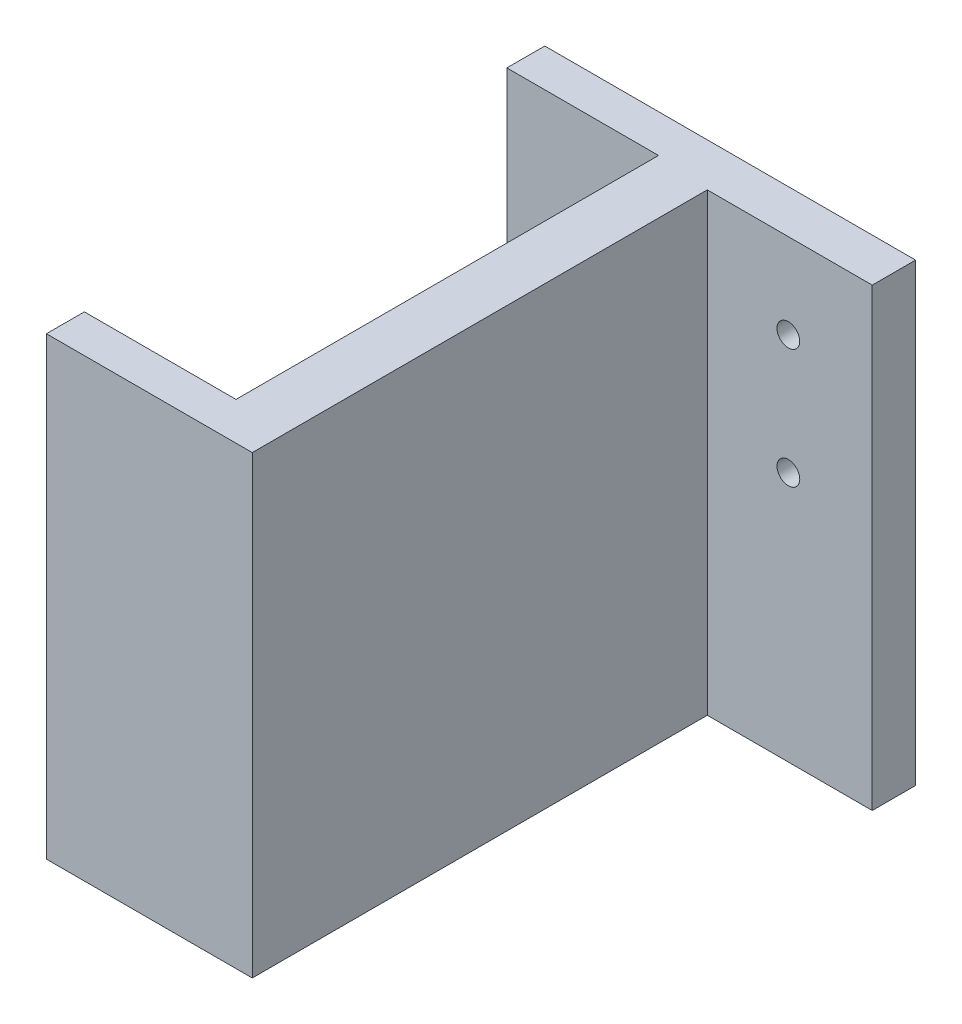
ISO-10303-21;
HEADER;
FILE_DESCRIPTION(('STEP AP214'),'2;1');
FILE_NAME('part.step','',(''),(''),'','','');
FILE_SCHEMA(('AUTOMOTIVE_DESIGN { 1 0 10303 214 1 1 1 1 }'));
ENDSEC;
DATA;
#1=APPLICATION_CONTEXT('core data for automotive mechanical design processes');
#2=APPLICATION_PROTOCOL_DEFINITION('international standard','automotive_design',2000,#1);
#3=PRODUCT_CONTEXT('',#1,'mechanical');
#4=PRODUCT('Part','Part','',(#3));
#5=PRODUCT_RELATED_PRODUCT_CATEGORY('part','',(#4));
#6=PRODUCT_DEFINITION_FORMATION('','',#4);
#7=PRODUCT_DEFINITION_CONTEXT('part definition',#1,'design');
#8=PRODUCT_DEFINITION('design','',#6,#7);
#9=PRODUCT_DEFINITION_SHAPE('','',#8);
#10=(LENGTH_UNIT() NAMED_UNIT(*) SI_UNIT(.MILLI.,.METRE.));
#11=(NAMED_UNIT(*) PLANE_ANGLE_UNIT() SI_UNIT($,.RADIAN.));
#12=(NAMED_UNIT(*) SI_UNIT($,.STERADIAN.) SOLID_ANGLE_UNIT());
#13=UNCERTAINTY_MEASURE_WITH_UNIT(LENGTH_MEASURE(1.E-05),#10,'distance_accuracy_value','');
#14=(GEOMETRIC_REPRESENTATION_CONTEXT(3) GLOBAL_UNCERTAINTY_ASSIGNED_CONTEXT((#13)) GLOBAL_UNIT_ASSIGNED_CONTEXT((#10,
#11,#12)) REPRESENTATION_CONTEXT('',''));
#15=CARTESIAN_POINT('',(0.,0.,0.));
#16=DIRECTION('',(0.,0.,1.));
#17=DIRECTION('',(1.,0.,0.));
#18=AXIS2_PLACEMENT_3D('',#15,#16,#17);
#19=CARTESIAN_POINT('',(0.,30.,0.));
#20=DIRECTION('',(1.,0.,0.));
#21=DIRECTION('',(0.,0.,-1.));
#22=AXIS2_PLACEMENT_3D('',#19,#20,#21);
#23=PLANE('',#22);
#24=DIRECTION('',(0.,1.,0.));
#25=VECTOR('',#24,1.);
#26=CARTESIAN_POINT('',(0.,27.5,-30.3571428571429));
#27=LINE('',#26,#25);
#28=CARTESIAN_POINT('',(0.,2.5,-30.3571428571429));
#29=VERTEX_POINT('',#28);
#30=CARTESIAN_POINT('',(0.,30.,-30.3571428571429));
#31=VERTEX_POINT('',#30);
#32=EDGE_CURVE('E56',#29,#31,#27,.T.);
#33=ORIENTED_EDGE('',*,*,#32,.F.);
#34=DIRECTION('',(0.,0.,-1.));
#35=VECTOR('',#34,1.);
#36=CARTESIAN_POINT('',(0.,2.5,-30.3571428571429));
#37=LINE('',#36,#35);
#38=CARTESIAN_POINT('',(0.,2.5,-2.5));
#39=VERTEX_POINT('',#38);
#40=EDGE_CURVE('E232',#39,#29,#37,.T.);
#41=ORIENTED_EDGE('',*,*,#40,.F.);
#42=DIRECTION('',(0.,-1.,0.));
#43=VECTOR('',#42,1.);
#44=CARTESIAN_POINT('',(0.,2.5,-2.5));
#45=LINE('',#44,#43);
#46=CARTESIAN_POINT('',(0.,30.,-2.5));
#47=VERTEX_POINT('',#46);
#48=EDGE_CURVE('E61',#47,#39,#45,.T.);
#49=ORIENTED_EDGE('',*,*,#48,.F.);
#50=DIRECTION('',(0.,0.,1.));
#51=VECTOR('',#50,1.);
#52=CARTESIAN_POINT('',(0.,30.,0.));
#53=LINE('',#52,#51);
#54=EDGE_CURVE('E142',#31,#47,#53,.T.);
#55=ORIENTED_EDGE('',*,*,#54,.F.);
#56=EDGE_LOOP('',(#33,#41,#49,#55));
#57=FACE_BOUND('',#56,.T.);
#58=ADVANCED_FACE('F38',(#57),#23,.F.);
#59=CARTESIAN_POINT('',(3.57142857142857,30.,0.));
#60=DIRECTION('',(0.,0.,-1.));
#61=DIRECTION('',(-1.,0.,0.));
#62=AXIS2_PLACEMENT_3D('',#59,#60,#61);
#63=PLANE('',#62);
#64=DIRECTION('',(1.,0.,0.));
#65=VECTOR('',#64,1.);
#66=CARTESIAN_POINT('',(3.57142857142857,0.,0.));
#67=LINE('',#66,#65);
#68=CARTESIAN_POINT('',(-10.,0.,0.));
#69=VERTEX_POINT('',#68);
#70=CARTESIAN_POINT('',(3.57142857142857,0.,0.));
#71=VERTEX_POINT('',#70);
#72=EDGE_CURVE('E144',#69,#71,#67,.T.);
#73=ORIENTED_EDGE('',*,*,#72,.T.);
#74=DIRECTION('',(0.,-1.,0.));
#75=VECTOR('',#74,1.);
#76=CARTESIAN_POINT('',(3.57142857142857,30.,0.));
#77=LINE('',#76,#75);
#78=CARTESIAN_POINT('',(3.57142857142857,30.,0.));
#79=VERTEX_POINT('',#78);
#80=EDGE_CURVE('E11',#79,#71,#77,.T.);
#81=ORIENTED_EDGE('',*,*,#80,.F.);
#82=DIRECTION('',(1.,0.,0.));
#83=VECTOR('',#82,1.);
#84=CARTESIAN_POINT('',(3.57142857142857,30.,0.));
#85=LINE('',#84,#83);
#86=CARTESIAN_POINT('',(-10.,30.,0.));
#87=VERTEX_POINT('',#86);
#88=EDGE_CURVE('E155',#87,#79,#85,.T.);
#89=ORIENTED_EDGE('',*,*,#88,.F.);
#90=DIRECTION('',(0.,1.,0.));
#91=VECTOR('',#90,1.);
#92=CARTESIAN_POINT('',(-10.,30.,0.));
#93=LINE('',#92,#91);
#94=EDGE_CURVE('E135',#69,#87,#93,.T.);
#95=ORIENTED_EDGE('',*,*,#94,.F.);
#96=EDGE_LOOP('',(#73,#81,#89,#95));
#97=FACE_BOUND('',#96,.T.);
#98=ADVANCED_FACE('F40',(#97),#63,.F.);
#99=CARTESIAN_POINT('',(3.57142857142857,30.,-30.));
#100=DIRECTION('',(-1.,0.,0.));
#101=DIRECTION('',(0.,0.,1.));
#102=AXIS2_PLACEMENT_3D('',#99,#100,#101);
#103=PLANE('',#102);
#104=DIRECTION('',(0.,0.,-1.));
#105=VECTOR('',#104,1.);
#106=CARTESIAN_POINT('',(3.57142857142857,0.,-30.));
#107=LINE('',#106,#105);
#108=CARTESIAN_POINT('',(3.57142857142857,0.,-30.));
#109=VERTEX_POINT('',#108);
#110=EDGE_CURVE('E149',#71,#109,#107,.T.);
#111=ORIENTED_EDGE('',*,*,#110,.T.);
#112=DIRECTION('',(0.,-1.,0.));
#113=VECTOR('',#112,1.);
#114=CARTESIAN_POINT('',(3.57142857142857,30.,-30.));
#115=LINE('',#114,#113);
#116=CARTESIAN_POINT('',(3.57142857142857,30.,-30.));
#117=VERTEX_POINT('',#116);
#118=EDGE_CURVE('E48',#117,#109,#115,.T.);
#119=ORIENTED_EDGE('',*,*,#118,.F.);
#120=DIRECTION('',(0.,0.,-1.));
#121=VECTOR('',#120,1.);
#122=CARTESIAN_POINT('',(3.57142857142857,30.,-30.));
#123=LINE('',#122,#121);
#124=EDGE_CURVE('E158',#79,#117,#123,.T.);
#125=ORIENTED_EDGE('',*,*,#124,.F.);
#126=ORIENTED_EDGE('',*,*,#80,.T.);
#127=EDGE_LOOP('',(#111,#119,#125,#126));
#128=FACE_BOUND('',#127,.T.);
#129=ADVANCED_FACE('F252',(#128),#103,.F.);
#130=CARTESIAN_POINT('',(14.4463412090147,30.,-30.));
#131=DIRECTION('',(0.,0.,-1.));
#132=DIRECTION('',(-1.,0.,0.));
#133=AXIS2_PLACEMENT_3D('',#130,#131,#132);
#134=PLANE('',#133);
#135=CARTESIAN_POINT('',(8.91712718013756,24.3963093169188,-30.));
#136=DIRECTION('',(0.,0.,1.));
#137=DIRECTION('',(1.,0.,0.));
#138=AXIS2_PLACEMENT_3D('',#135,#136,#137);
#139=CIRCLE('',#138,0.75);
#140=CARTESIAN_POINT('',(9.66712718013756,24.3963093169188,-30.));
#141=VERTEX_POINT('',#140);
#142=EDGE_CURVE('E196',#141,#141,#139,.T.);
#143=ORIENTED_EDGE('',*,*,#142,.F.);
#144=EDGE_LOOP('',(#143));
#145=FACE_BOUND('',#144,.T.);
#146=CARTESIAN_POINT('',(8.91712718013756,16.5263093169188,-30.));
#147=DIRECTION('',(0.,0.,1.));
#148=DIRECTION('',(1.,0.,0.));
#149=AXIS2_PLACEMENT_3D('',#146,#147,#148);
#150=CIRCLE('',#149,0.75);
#151=CARTESIAN_POINT('',(9.66712718013756,16.5263093169188,-30.));
#152=VERTEX_POINT('',#151);
#153=EDGE_CURVE('E203',#152,#152,#150,.T.);
#154=ORIENTED_EDGE('',*,*,#153,.F.);
#155=EDGE_LOOP('',(#154));
#156=FACE_BOUND('',#155,.T.);
#157=DIRECTION('',(1.,0.,0.));
#158=VECTOR('',#157,1.);
#159=CARTESIAN_POINT('',(14.4463412090147,0.,-30.));
#160=LINE('',#159,#158);
#161=CARTESIAN_POINT('',(14.4463412090147,0.,-30.));
#162=VERTEX_POINT('',#161);
#163=EDGE_CURVE('E176',#109,#162,#160,.T.);
#164=ORIENTED_EDGE('',*,*,#163,.T.);
#165=DIRECTION('',(0.,-1.,0.));
#166=VECTOR('',#165,1.);
#167=CARTESIAN_POINT('',(14.4463412090147,30.,-30.));
#168=LINE('',#167,#166);
#169=CARTESIAN_POINT('',(14.4463412090147,30.,-30.));
#170=VERTEX_POINT('',#169);
#171=EDGE_CURVE('E187',#170,#162,#168,.T.);
#172=ORIENTED_EDGE('',*,*,#171,.F.);
#173=DIRECTION('',(1.,0.,0.));
#174=VECTOR('',#173,1.);
#175=CARTESIAN_POINT('',(14.4463412090147,30.,-30.));
#176=LINE('',#175,#174);
#177=EDGE_CURVE('E162',#117,#170,#176,.T.);
#178=ORIENTED_EDGE('',*,*,#177,.F.);
#179=ORIENTED_EDGE('',*,*,#118,.T.);
#180=EDGE_LOOP('',(#164,#172,#178,#179));
#181=FACE_BOUND('',#180,.T.);
#182=ADVANCED_FACE('F265',(#145,#156,#181),#134,.F.);
#183=CARTESIAN_POINT('',(14.4463412090147,30.,-32.8571428571428));
#184=DIRECTION('',(-1.,0.,0.));
#185=DIRECTION('',(0.,0.,1.));
#186=AXIS2_PLACEMENT_3D('',#183,#184,#185);
#187=PLANE('',#186);
#188=DIRECTION('',(0.,0.,-1.));
#189=VECTOR('',#188,1.);
#190=CARTESIAN_POINT('',(14.4463412090147,0.,-32.8571428571428));
#191=LINE('',#190,#189);
#192=CARTESIAN_POINT('',(14.4463412090147,0.,-32.8571428571428));
#193=VERTEX_POINT('',#192);
#194=EDGE_CURVE('E179',#162,#193,#191,.T.);
#195=ORIENTED_EDGE('',*,*,#194,.T.);
#196=DIRECTION('',(0.,-1.,0.));
#197=VECTOR('',#196,1.);
#198=CARTESIAN_POINT('',(14.4463412090147,30.,-32.8571428571428));
#199=LINE('',#198,#197);
#200=CARTESIAN_POINT('',(14.4463412090147,30.,-32.8571428571428));
#201=VERTEX_POINT('',#200);
#202=EDGE_CURVE('E172',#201,#193,#199,.T.);
#203=ORIENTED_EDGE('',*,*,#202,.F.);
#204=DIRECTION('',(0.,0.,-1.));
#205=VECTOR('',#204,1.);
#206=CARTESIAN_POINT('',(14.4463412090147,30.,-32.8571428571428));
#207=LINE('',#206,#205);
#208=EDGE_CURVE('E165',#170,#201,#207,.T.);
#209=ORIENTED_EDGE('',*,*,#208,.F.);
#210=ORIENTED_EDGE('',*,*,#171,.T.);
#211=EDGE_LOOP('',(#195,#203,#209,#210));
#212=FACE_BOUND('',#211,.T.);
#213=ADVANCED_FACE('F261',(#212),#187,.F.);
#214=CARTESIAN_POINT('',(0.,30.,-32.8571428571428));
#215=DIRECTION('',(0.,0.,1.));
#216=DIRECTION('',(1.,0.,0.));
#217=AXIS2_PLACEMENT_3D('',#214,#215,#216);
#218=PLANE('',#217);
#219=CARTESIAN_POINT('',(8.91712718013756,24.3963093169188,-32.8571428571428));
#220=DIRECTION('',(0.,0.,1.));
#221=DIRECTION('',(1.,0.,0.));
#222=AXIS2_PLACEMENT_3D('',#219,#220,#221);
#223=CIRCLE('',#222,0.75);
#224=CARTESIAN_POINT('',(9.66712718013756,24.3963093169188,-32.8571428571428));
#225=VERTEX_POINT('',#224);
#226=EDGE_CURVE('E42',#225,#225,#223,.T.);
#227=ORIENTED_EDGE('',*,*,#226,.T.);
#228=EDGE_LOOP('',(#227));
#229=FACE_BOUND('',#228,.T.);
#230=CARTESIAN_POINT('',(8.91712718013756,16.5263093169188,-32.8571428571428));
#231=DIRECTION('',(0.,0.,1.));
#232=DIRECTION('',(1.,0.,0.));
#233=AXIS2_PLACEMENT_3D('',#230,#231,#232);
#234=CIRCLE('',#233,0.75);
#235=CARTESIAN_POINT('',(9.66712718013756,16.5263093169188,-32.8571428571428));
#236=VERTEX_POINT('',#235);
#237=EDGE_CURVE('E193',#236,#236,#234,.T.);
#238=ORIENTED_EDGE('',*,*,#237,.T.);
#239=EDGE_LOOP('',(#238));
#240=FACE_BOUND('',#239,.T.);
#241=DIRECTION('',(-1.,0.,0.));
#242=VECTOR('',#241,1.);
#243=CARTESIAN_POINT('',(0.,0.,-32.8571428571428));
#244=LINE('',#243,#242);
#245=CARTESIAN_POINT('',(-10.,0.,-32.8571428571428));
#246=VERTEX_POINT('',#245);
#247=EDGE_CURVE('E159',#193,#246,#244,.T.);
#248=ORIENTED_EDGE('',*,*,#247,.T.);
#249=DIRECTION('',(0.,-1.,0.));
#250=VECTOR('',#249,1.);
#251=CARTESIAN_POINT('',(-10.,30.,-32.8571428571428));
#252=LINE('',#251,#250);
#253=CARTESIAN_POINT('',(-10.,30.,-32.8571428571428));
#254=VERTEX_POINT('',#253);
#255=EDGE_CURVE('E220',#254,#246,#252,.T.);
#256=ORIENTED_EDGE('',*,*,#255,.F.);
#257=DIRECTION('',(-1.,0.,0.));
#258=VECTOR('',#257,1.);
#259=CARTESIAN_POINT('',(0.,30.,-32.8571428571428));
#260=LINE('',#259,#258);
#261=EDGE_CURVE('E168',#201,#254,#260,.T.);
#262=ORIENTED_EDGE('',*,*,#261,.F.);
#263=ORIENTED_EDGE('',*,*,#202,.T.);
#264=EDGE_LOOP('',(#248,#256,#262,#263));
#265=FACE_BOUND('',#264,.T.);
#266=ADVANCED_FACE('F258',(#229,#240,#265),#218,.F.);
#267=CARTESIAN_POINT('',(0.,30.,0.));
#268=DIRECTION('',(0.,-1.,0.));
#269=DIRECTION('',(0.,0.,-1.));
#270=AXIS2_PLACEMENT_3D('',#267,#268,#269);
#271=PLANE('',#270);
#272=ORIENTED_EDGE('',*,*,#88,.T.);
#273=ORIENTED_EDGE('',*,*,#124,.T.);
#274=ORIENTED_EDGE('',*,*,#177,.T.);
#275=ORIENTED_EDGE('',*,*,#208,.T.);
#276=ORIENTED_EDGE('',*,*,#261,.T.);
#277=DIRECTION('',(0.,0.,-1.));
#278=VECTOR('',#277,1.);
#279=CARTESIAN_POINT('',(-10.,30.,-30.3571428571429));
#280=LINE('',#279,#278);
#281=CARTESIAN_POINT('',(-10.,30.,-30.3571428571429));
#282=VERTEX_POINT('',#281);
#283=EDGE_CURVE('E216',#282,#254,#280,.T.);
#284=ORIENTED_EDGE('',*,*,#283,.F.);
#285=DIRECTION('',(1.,0.,0.));
#286=VECTOR('',#285,1.);
#287=CARTESIAN_POINT('',(-10.,30.,-30.3571428571429));
#288=LINE('',#287,#286);
#289=EDGE_CURVE('E229',#282,#31,#288,.T.);
#290=ORIENTED_EDGE('',*,*,#289,.T.);
#291=ORIENTED_EDGE('',*,*,#54,.T.);
#292=DIRECTION('',(1.,0.,0.));
#293=VECTOR('',#292,1.);
#294=CARTESIAN_POINT('',(-10.,30.,-2.5));
#295=LINE('',#294,#293);
#296=CARTESIAN_POINT('',(-10.,30.,-2.5));
#297=VERTEX_POINT('',#296);
#298=EDGE_CURVE('E121',#297,#47,#295,.T.);
#299=ORIENTED_EDGE('',*,*,#298,.F.);
#300=DIRECTION('',(0.,0.,-1.));
#301=VECTOR('',#300,1.);
#302=CARTESIAN_POINT('',(-10.,30.,-2.5));
#303=LINE('',#302,#301);
#304=EDGE_CURVE('E128',#87,#297,#303,.T.);
#305=ORIENTED_EDGE('',*,*,#304,.F.);
#306=EDGE_LOOP('',(#272,#273,#274,#275,#276,#284,#290,#291,#299,#305));
#307=FACE_BOUND('',#306,.T.);
#308=ADVANCED_FACE('F140',(#307),#271,.F.);
#309=CARTESIAN_POINT('',(0.,0.,0.));
#310=DIRECTION('',(0.,-1.,0.));
#311=DIRECTION('',(0.,0.,-1.));
#312=AXIS2_PLACEMENT_3D('',#309,#310,#311);
#313=PLANE('',#312);
#314=ORIENTED_EDGE('',*,*,#72,.F.);
#315=DIRECTION('',(0.,0.,1.));
#316=VECTOR('',#315,1.);
#317=CARTESIAN_POINT('',(-10.,0.,-30.3571428571429));
#318=LINE('',#317,#316);
#319=EDGE_CURVE('E224',#246,#69,#318,.T.);
#320=ORIENTED_EDGE('',*,*,#319,.F.);
#321=ORIENTED_EDGE('',*,*,#247,.F.);
#322=ORIENTED_EDGE('',*,*,#194,.F.);
#323=ORIENTED_EDGE('',*,*,#163,.F.);
#324=ORIENTED_EDGE('',*,*,#110,.F.);
#325=EDGE_LOOP('',(#314,#320,#321,#322,#323,#324));
#326=FACE_BOUND('',#325,.T.);
#327=ADVANCED_FACE('F256',(#326),#313,.T.);
#328=CARTESIAN_POINT('',(-10.,2.5,-2.5));
#329=DIRECTION('',(0.,0.,1.));
#330=DIRECTION('',(1.,0.,0.));
#331=AXIS2_PLACEMENT_3D('',#328,#329,#330);
#332=PLANE('',#331);
#333=ORIENTED_EDGE('',*,*,#48,.T.);
#334=DIRECTION('',(1.,0.,0.));
#335=VECTOR('',#334,1.);
#336=CARTESIAN_POINT('',(-10.,2.5,-2.5));
#337=LINE('',#336,#335);
#338=CARTESIAN_POINT('',(-10.,2.5,-2.5));
#339=VERTEX_POINT('',#338);
#340=EDGE_CURVE('E123',#339,#39,#337,.T.);
#341=ORIENTED_EDGE('',*,*,#340,.F.);
#342=DIRECTION('',(0.,-1.,0.));
#343=VECTOR('',#342,1.);
#344=CARTESIAN_POINT('',(-10.,27.5,-2.5));
#345=LINE('',#344,#343);
#346=EDGE_CURVE('E117',#297,#339,#345,.T.);
#347=ORIENTED_EDGE('',*,*,#346,.F.);
#348=ORIENTED_EDGE('',*,*,#298,.T.);
#349=EDGE_LOOP('',(#333,#341,#347,#348));
#350=FACE_BOUND('',#349,.T.);
#351=ADVANCED_FACE('F119',(#350),#332,.F.);
#352=CARTESIAN_POINT('',(-10.,2.5,-30.3571428571429));
#353=DIRECTION('',(0.,-1.,0.));
#354=DIRECTION('',(0.,0.,-1.));
#355=AXIS2_PLACEMENT_3D('',#352,#353,#354);
#356=PLANE('',#355);
#357=ORIENTED_EDGE('',*,*,#40,.T.);
#358=DIRECTION('',(1.,0.,0.));
#359=VECTOR('',#358,1.);
#360=CARTESIAN_POINT('',(-10.,2.5,-30.3571428571429));
#361=LINE('',#360,#359);
#362=CARTESIAN_POINT('',(-10.,2.5,-30.3571428571429));
#363=VERTEX_POINT('',#362);
#364=EDGE_CURVE('E151',#363,#29,#361,.T.);
#365=ORIENTED_EDGE('',*,*,#364,.F.);
#366=DIRECTION('',(0.,0.,-1.));
#367=VECTOR('',#366,1.);
#368=CARTESIAN_POINT('',(-10.,2.5,-30.3571428571429));
#369=LINE('',#368,#367);
#370=EDGE_CURVE('E127',#339,#363,#369,.T.);
#371=ORIENTED_EDGE('',*,*,#370,.F.);
#372=ORIENTED_EDGE('',*,*,#340,.T.);
#373=EDGE_LOOP('',(#357,#365,#371,#372));
#374=FACE_BOUND('',#373,.T.);
#375=ADVANCED_FACE('F246',(#374),#356,.F.);
#376=CARTESIAN_POINT('',(-10.,27.5,-30.3571428571429));
#377=DIRECTION('',(0.,0.,-1.));
#378=DIRECTION('',(-1.,0.,0.));
#379=AXIS2_PLACEMENT_3D('',#376,#377,#378);
#380=PLANE('',#379);
#381=ORIENTED_EDGE('',*,*,#32,.T.);
#382=ORIENTED_EDGE('',*,*,#289,.F.);
#383=DIRECTION('',(0.,1.,0.));
#384=VECTOR('',#383,1.);
#385=CARTESIAN_POINT('',(-10.,27.5,-30.3571428571429));
#386=LINE('',#385,#384);
#387=EDGE_CURVE('E213',#363,#282,#386,.T.);
#388=ORIENTED_EDGE('',*,*,#387,.F.);
#389=ORIENTED_EDGE('',*,*,#364,.T.);
#390=EDGE_LOOP('',(#381,#382,#388,#389));
#391=FACE_BOUND('',#390,.T.);
#392=ADVANCED_FACE('F243',(#391),#380,.F.);
#393=CARTESIAN_POINT('',(-10.,0.,0.));
#394=DIRECTION('',(1.,0.,0.));
#395=DIRECTION('',(0.,0.,-1.));
#396=AXIS2_PLACEMENT_3D('',#393,#394,#395);
#397=PLANE('',#396);
#398=ORIENTED_EDGE('',*,*,#304,.T.);
#399=ORIENTED_EDGE('',*,*,#346,.T.);
#400=ORIENTED_EDGE('',*,*,#370,.T.);
#401=ORIENTED_EDGE('',*,*,#387,.T.);
#402=ORIENTED_EDGE('',*,*,#283,.T.);
#403=ORIENTED_EDGE('',*,*,#255,.T.);
#404=ORIENTED_EDGE('',*,*,#319,.T.);
#405=ORIENTED_EDGE('',*,*,#94,.T.);
#406=EDGE_LOOP('',(#398,#399,#400,#401,#402,#403,#404,#405));
#407=FACE_BOUND('',#406,.T.);
#408=ADVANCED_FACE('F132',(#407),#397,.F.);
#409=CARTESIAN_POINT('',(8.91712718013756,16.5263093169188,-40.));
#410=DIRECTION('',(0.,0.,1.));
#411=DIRECTION('',(1.,0.,0.));
#412=AXIS2_PLACEMENT_3D('',#409,#410,#411);
#413=CYLINDRICAL_SURFACE('',#412,0.75);
#414=ORIENTED_EDGE('',*,*,#153,.T.);
#415=EDGE_LOOP('',(#414));
#416=FACE_BOUND('',#415,.T.);
#417=ORIENTED_EDGE('',*,*,#237,.F.);
#418=EDGE_LOOP('',(#417));
#419=FACE_BOUND('',#418,.T.);
#420=ADVANCED_FACE('F306',(#416,#419),#413,.F.);
#421=CARTESIAN_POINT('',(8.91712718013756,24.3963093169188,-40.));
#422=DIRECTION('',(0.,0.,1.));
#423=DIRECTION('',(1.,0.,0.));
#424=AXIS2_PLACEMENT_3D('',#421,#422,#423);
#425=CYLINDRICAL_SURFACE('',#424,0.75);
#426=ORIENTED_EDGE('',*,*,#142,.T.);
#427=EDGE_LOOP('',(#426));
#428=FACE_BOUND('',#427,.T.);
#429=ORIENTED_EDGE('',*,*,#226,.F.);
#430=EDGE_LOOP('',(#429));
#431=FACE_BOUND('',#430,.T.);
#432=ADVANCED_FACE('F309',(#428,#431),#425,.F.);
#433=CLOSED_SHELL('',(#58,#98,#129,#182,#213,#266,#308,#327,#351,#375,#392,#408,#420,#432));
#434=MANIFOLD_SOLID_BREP('B2',#433);
#435=ADVANCED_BREP_SHAPE_REPRESENTATION('',(#18,#434),#14);
#436=SHAPE_DEFINITION_REPRESENTATION(#9,#435);
ENDSEC;
END-ISO-10303-21;
